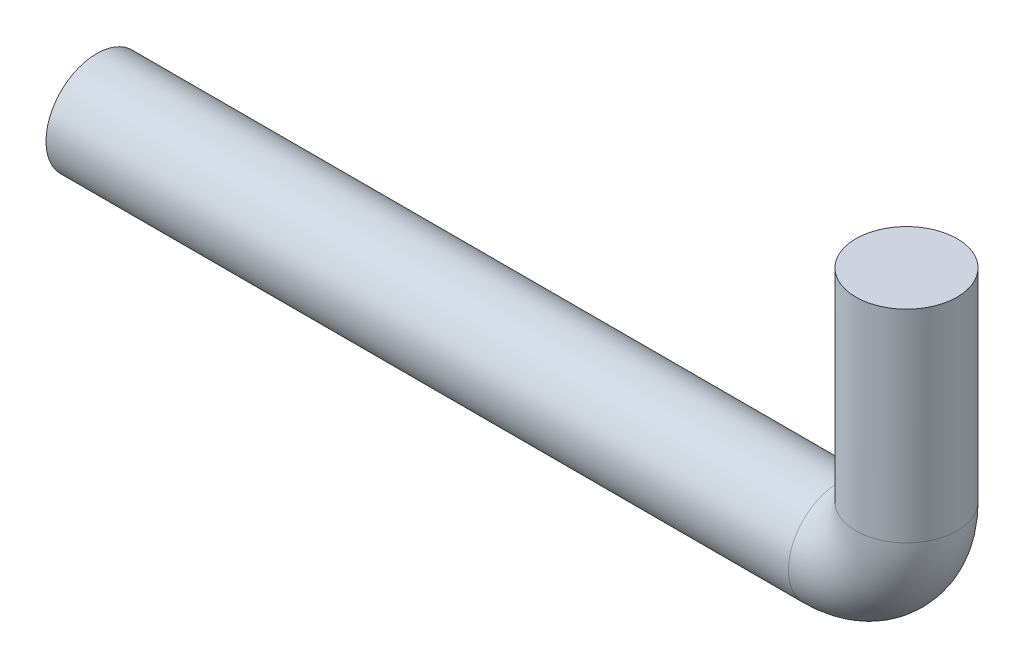
ISO-10303-21;
HEADER;
FILE_DESCRIPTION(('STEP AP214'),'2;1');
FILE_NAME('part.step','',(''),(''),'','','');
FILE_SCHEMA(('AUTOMOTIVE_DESIGN { 1 0 10303 214 1 1 1 1 }'));
ENDSEC;
DATA;
#1=APPLICATION_CONTEXT('core data for automotive mechanical design processes');
#2=APPLICATION_PROTOCOL_DEFINITION('international standard','automotive_design',2000,#1);
#3=PRODUCT_CONTEXT('',#1,'mechanical');
#4=PRODUCT('Part','Part','',(#3));
#5=PRODUCT_RELATED_PRODUCT_CATEGORY('part','',(#4));
#6=PRODUCT_DEFINITION_FORMATION('','',#4);
#7=PRODUCT_DEFINITION_CONTEXT('part definition',#1,'design');
#8=PRODUCT_DEFINITION('design','',#6,#7);
#9=PRODUCT_DEFINITION_SHAPE('','',#8);
#10=(LENGTH_UNIT() NAMED_UNIT(*) SI_UNIT(.MILLI.,.METRE.));
#11=(NAMED_UNIT(*) PLANE_ANGLE_UNIT() SI_UNIT($,.RADIAN.));
#12=(NAMED_UNIT(*) SI_UNIT($,.STERADIAN.) SOLID_ANGLE_UNIT());
#13=UNCERTAINTY_MEASURE_WITH_UNIT(LENGTH_MEASURE(1.E-05),#10,'distance_accuracy_value','');
#14=(GEOMETRIC_REPRESENTATION_CONTEXT(3) GLOBAL_UNCERTAINTY_ASSIGNED_CONTEXT((#13)) GLOBAL_UNIT_ASSIGNED_CONTEXT((#10,
#11,#12)) REPRESENTATION_CONTEXT('',''));
#15=CARTESIAN_POINT('',(0.,0.,0.));
#16=DIRECTION('',(0.,0.,1.));
#17=DIRECTION('',(1.,0.,0.));
#18=AXIS2_PLACEMENT_3D('',#15,#16,#17);
#19=CARTESIAN_POINT('',(0.,50.8,0.));
#20=DIRECTION('',(0.,1.,0.));
#21=DIRECTION('',(-1.,0.,0.));
#22=AXIS2_PLACEMENT_3D('',#19,#20,#21);
#23=PLANE('',#22);
#24=CARTESIAN_POINT('',(0.,50.8,0.));
#25=DIRECTION('',(0.,1.,0.));
#26=DIRECTION('',(-1.,0.,0.));
#27=AXIS2_PLACEMENT_3D('',#24,#25,#26);
#28=CIRCLE('',#27,9.525);
#29=CARTESIAN_POINT('',(-9.525,50.8,0.));
#30=VERTEX_POINT('',#29);
#31=EDGE_CURVE('E66',#30,#30,#28,.T.);
#32=ORIENTED_EDGE('',*,*,#31,.T.);
#33=EDGE_LOOP('',(#32));
#34=FACE_BOUND('',#33,.T.);
#35=ADVANCED_FACE('F49',(#34),#23,.T.);
#36=CARTESIAN_POINT('',(-152.4,0.,0.));
#37=DIRECTION('',(1.,0.,0.));
#38=DIRECTION('',(0.,1.,0.));
#39=AXIS2_PLACEMENT_3D('',#36,#37,#38);
#40=PLANE('',#39);
#41=CARTESIAN_POINT('',(-152.4,0.,0.));
#42=DIRECTION('',(1.,0.,0.));
#43=DIRECTION('',(0.,1.,0.));
#44=AXIS2_PLACEMENT_3D('',#41,#42,#43);
#45=CIRCLE('',#44,9.525);
#46=CARTESIAN_POINT('',(-152.4,9.52499999999998,0.));
#47=VERTEX_POINT('',#46);
#48=EDGE_CURVE('E11',#47,#47,#45,.T.);
#49=ORIENTED_EDGE('',*,*,#48,.F.);
#50=EDGE_LOOP('',(#49));
#51=FACE_BOUND('',#50,.T.);
#52=ADVANCED_FACE('F77',(#51),#40,.F.);
#53=CARTESIAN_POINT('',(0.,50.8,0.));
#54=DIRECTION('',(0.,-1.,0.));
#55=DIRECTION('',(0.,0.,-1.));
#56=AXIS2_PLACEMENT_3D('',#53,#54,#55);
#57=CYLINDRICAL_SURFACE('',#56,9.525);
#58=CARTESIAN_POINT('',(0.,12.7000000000001,0.));
#59=DIRECTION('',(0.,1.,0.));
#60=DIRECTION('',(-1.,0.,0.));
#61=AXIS2_PLACEMENT_3D('',#58,#59,#60);
#62=CIRCLE('',#61,9.525);
#63=CARTESIAN_POINT('',(9.525,12.7000000000001,0.));
#64=VERTEX_POINT('',#63);
#65=EDGE_CURVE('E61',#64,#64,#62,.T.);
#66=ORIENTED_EDGE('',*,*,#65,.T.);
#67=EDGE_LOOP('',(#66));
#68=FACE_BOUND('',#67,.T.);
#69=ORIENTED_EDGE('',*,*,#31,.F.);
#70=EDGE_LOOP('',(#69));
#71=FACE_BOUND('',#70,.T.);
#72=ADVANCED_FACE('F74',(#68,#71),#57,.T.);
#73=CARTESIAN_POINT('',(-12.7,12.7,0.));
#74=DIRECTION('',(0.,0.,-1.));
#75=DIRECTION('',(-1.,0.,0.));
#76=AXIS2_PLACEMENT_3D('',#73,#74,#75);
#77=TOROIDAL_SURFACE('',#76,12.7,9.525);
#78=CARTESIAN_POINT('',(-12.7000000000001,-1.07861769204236E-12,0.));
#79=DIRECTION('',(1.,0.,0.));
#80=DIRECTION('',(0.,1.,0.));
#81=AXIS2_PLACEMENT_3D('',#78,#79,#80);
#82=CIRCLE('',#81,9.525);
#83=CARTESIAN_POINT('',(-12.7000000000001,-9.525,0.));
#84=VERTEX_POINT('',#83);
#85=EDGE_CURVE('E56',#84,#84,#82,.T.);
#86=CARTESIAN_POINT('',(-12.7,12.7,0.));
#87=DIRECTION('',(0.,0.,-1.));
#88=DIRECTION('',(-1.,0.,0.));
#89=AXIS2_PLACEMENT_3D('',#86,#87,#88);
#90=CIRCLE('',#89,22.225);
#91=EDGE_CURVE('',#64,#84,#90,.T.);
#92=ORIENTED_EDGE('',*,*,#65,.F.);
#93=ORIENTED_EDGE('',*,*,#85,.T.);
#94=ORIENTED_EDGE('',*,*,#91,.T.);
#95=ORIENTED_EDGE('',*,*,#91,.F.);
#96=EDGE_LOOP('',(#92,#94,#93,#95));
#97=FACE_BOUND('',#96,.T.);
#98=ADVANCED_FACE('F76',(#97),#77,.T.);
#99=CARTESIAN_POINT('',(-12.7000000000001,0.,0.));
#100=DIRECTION('',(-1.,0.,0.));
#101=DIRECTION('',(0.,-1.,0.));
#102=AXIS2_PLACEMENT_3D('',#99,#100,#101);
#103=CYLINDRICAL_SURFACE('',#102,9.525);
#104=ORIENTED_EDGE('',*,*,#48,.T.);
#105=EDGE_LOOP('',(#104));
#106=FACE_BOUND('',#105,.T.);
#107=ORIENTED_EDGE('',*,*,#85,.F.);
#108=EDGE_LOOP('',(#107));
#109=FACE_BOUND('',#108,.T.);
#110=ADVANCED_FACE('F84',(#106,#109),#103,.T.);
#111=CLOSED_SHELL('',(#35,#52,#72,#98,#110));
#112=MANIFOLD_SOLID_BREP('B2',#111);
#113=ADVANCED_BREP_SHAPE_REPRESENTATION('',(#18,#112),#14);
#114=SHAPE_DEFINITION_REPRESENTATION(#9,#113);
ENDSEC;
END-ISO-10303-21;
